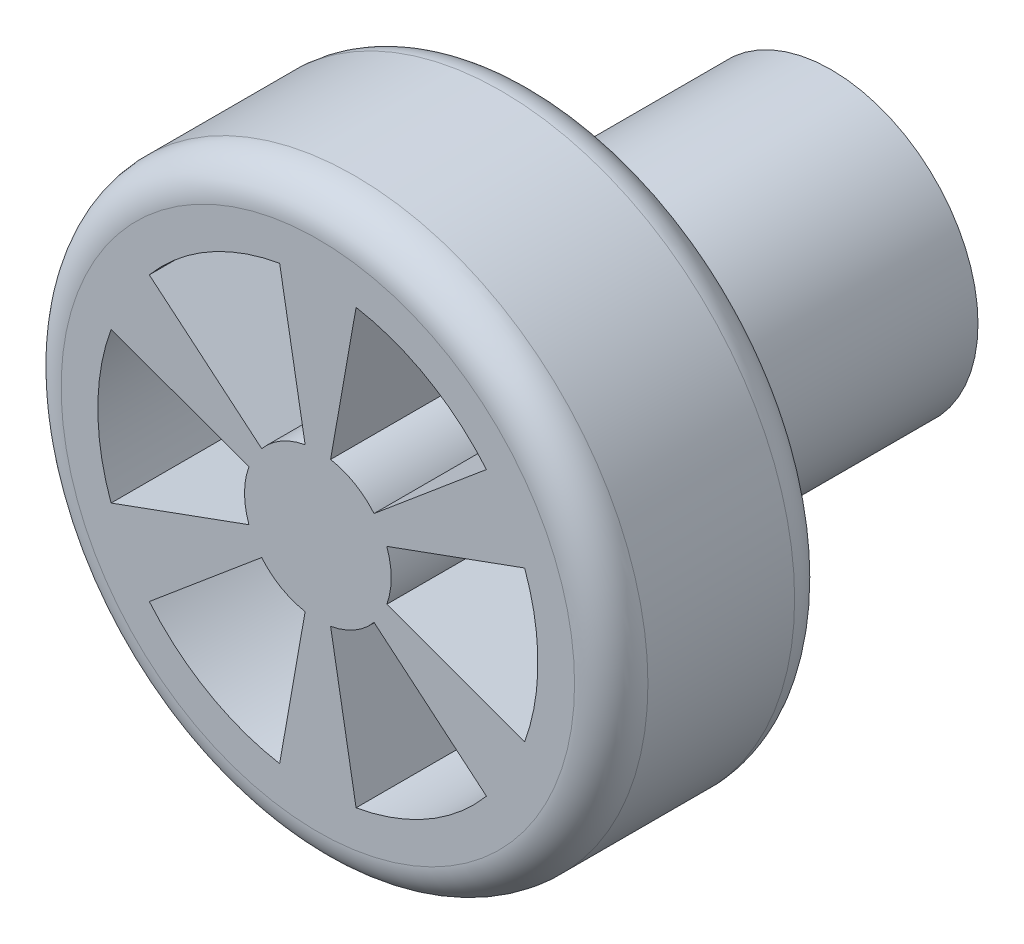
ISO-10303-21;
HEADER;
FILE_DESCRIPTION(('STEP AP214'),'2;1');
FILE_NAME('part.step','',(''),(''),'','','');
FILE_SCHEMA(('AUTOMOTIVE_DESIGN { 1 0 10303 214 1 1 1 1 }'));
ENDSEC;
DATA;
#1=APPLICATION_CONTEXT('core data for automotive mechanical design processes');
#2=APPLICATION_PROTOCOL_DEFINITION('international standard','automotive_design',2000,#1);
#3=PRODUCT_CONTEXT('',#1,'mechanical');
#4=PRODUCT('Part','Part','',(#3));
#5=PRODUCT_RELATED_PRODUCT_CATEGORY('part','',(#4));
#6=PRODUCT_DEFINITION_FORMATION('','',#4);
#7=PRODUCT_DEFINITION_CONTEXT('part definition',#1,'design');
#8=PRODUCT_DEFINITION('design','',#6,#7);
#9=PRODUCT_DEFINITION_SHAPE('','',#8);
#10=(LENGTH_UNIT() NAMED_UNIT(*) SI_UNIT(.MILLI.,.METRE.));
#11=(NAMED_UNIT(*) PLANE_ANGLE_UNIT() SI_UNIT($,.RADIAN.));
#12=(NAMED_UNIT(*) SI_UNIT($,.STERADIAN.) SOLID_ANGLE_UNIT());
#13=UNCERTAINTY_MEASURE_WITH_UNIT(LENGTH_MEASURE(1.E-05),#10,'distance_accuracy_value','');
#14=(GEOMETRIC_REPRESENTATION_CONTEXT(3) GLOBAL_UNCERTAINTY_ASSIGNED_CONTEXT((#13)) GLOBAL_UNIT_ASSIGNED_CONTEXT((#10,
#11,#12)) REPRESENTATION_CONTEXT('',''));
#15=CARTESIAN_POINT('',(0.,0.,0.));
#16=DIRECTION('',(0.,0.,1.));
#17=DIRECTION('',(1.,0.,0.));
#18=AXIS2_PLACEMENT_3D('',#15,#16,#17);
#19=CARTESIAN_POINT('',(0.,0.,-101.6));
#20=DIRECTION('',(0.,0.,1.));
#21=DIRECTION('',(1.,0.,0.));
#22=AXIS2_PLACEMENT_3D('',#19,#20,#21);
#23=CYLINDRICAL_SURFACE('',#22,50.8);
#24=CARTESIAN_POINT('',(0.,0.,-101.6));
#25=DIRECTION('',(0.,0.,-1.));
#26=DIRECTION('',(-1.,0.,0.));
#27=AXIS2_PLACEMENT_3D('',#24,#25,#26);
#28=CIRCLE('',#27,50.8);
#29=CARTESIAN_POINT('',(-50.8,0.,-101.6));
#30=VERTEX_POINT('',#29);
#31=EDGE_CURVE('E11',#30,#30,#28,.T.);
#32=ORIENTED_EDGE('',*,*,#31,.F.);
#33=EDGE_LOOP('',(#32));
#34=FACE_BOUND('',#33,.T.);
#35=CARTESIAN_POINT('',(0.,0.,0.));
#36=DIRECTION('',(0.,0.,-1.));
#37=DIRECTION('',(-1.,0.,0.));
#38=AXIS2_PLACEMENT_3D('',#35,#36,#37);
#39=CIRCLE('',#38,50.8);
#40=CARTESIAN_POINT('',(-50.8,0.,0.));
#41=VERTEX_POINT('',#40);
#42=EDGE_CURVE('E50',#41,#41,#39,.T.);
#43=ORIENTED_EDGE('',*,*,#42,.T.);
#44=EDGE_LOOP('',(#43));
#45=FACE_BOUND('',#44,.T.);
#46=ADVANCED_FACE('F47',(#34,#45),#23,.T.);
#47=CARTESIAN_POINT('',(0.,0.,-101.6));
#48=DIRECTION('',(0.,0.,-1.));
#49=DIRECTION('',(-1.,0.,0.));
#50=AXIS2_PLACEMENT_3D('',#47,#48,#49);
#51=PLANE('',#50);
#52=ORIENTED_EDGE('',*,*,#31,.T.);
#53=EDGE_LOOP('',(#52));
#54=FACE_BOUND('',#53,.T.);
#55=ADVANCED_FACE('F62',(#54),#51,.T.);
#56=CARTESIAN_POINT('',(0.,0.,0.));
#57=DIRECTION('',(0.,0.,-1.));
#58=DIRECTION('',(-1.,0.,0.));
#59=AXIS2_PLACEMENT_3D('',#56,#57,#58);
#60=PLANE('',#59);
#61=ORIENTED_EDGE('',*,*,#42,.F.);
#62=EDGE_LOOP('',(#61));
#63=FACE_BOUND('',#62,.T.);
#64=ADVANCED_FACE('F60',(#63),#60,.F.);
#65=CLOSED_SHELL('',(#46,#55,#64));
#66=MANIFOLD_SOLID_BREP('B2',#65);
#67=CARTESIAN_POINT('',(0.,0.,76.2));
#68=DIRECTION('',(0.,0.,-1.));
#69=DIRECTION('',(-1.,0.,0.));
#70=AXIS2_PLACEMENT_3D('',#67,#68,#69);
#71=CYLINDRICAL_SURFACE('',#70,101.6);
#72=CARTESIAN_POINT('',(0.,0.,12.7));
#73=DIRECTION('',(0.,0.,1.));
#74=DIRECTION('',(1.,0.,0.));
#75=AXIS2_PLACEMENT_3D('',#72,#73,#74);
#76=CIRCLE('',#75,101.6);
#77=CARTESIAN_POINT('',(-101.6,0.,12.7));
#78=VERTEX_POINT('',#77);
#79=EDGE_CURVE('E523',#78,#78,#76,.T.);
#80=CARTESIAN_POINT('',(0.,0.,63.5));
#81=DIRECTION('',(0.,0.,1.));
#82=DIRECTION('',(1.,0.,0.));
#83=AXIS2_PLACEMENT_3D('',#80,#81,#82);
#84=CIRCLE('',#83,101.6);
#85=CARTESIAN_POINT('',(-101.6,0.,63.5));
#86=VERTEX_POINT('',#85);
#87=EDGE_CURVE('E519',#86,#86,#84,.F.);
#88=CARTESIAN_POINT('',(-101.6,0.,12.7));
#89=CARTESIAN_POINT('',(-101.6,0.,13.2291666666667));
#90=CARTESIAN_POINT('',(-101.6,0.,13.7583333333333));
#91=CARTESIAN_POINT('',(-101.6,0.,14.8166666666666));
#92=CARTESIAN_POINT('',(-101.6,0.,15.3458333333333));
#93=CARTESIAN_POINT('',(-101.6,0.,16.4041666666666));
#94=CARTESIAN_POINT('',(-101.6,0.,16.9333333333333));
#95=CARTESIAN_POINT('',(-101.6,0.,17.9916666666667));
#96=CARTESIAN_POINT('',(-101.6,0.,18.5208333333333));
#97=CARTESIAN_POINT('',(-101.6,0.,19.5791666666667));
#98=CARTESIAN_POINT('',(-101.6,0.,20.1083333333333));
#99=CARTESIAN_POINT('',(-101.6,0.,21.1666666666667));
#100=CARTESIAN_POINT('',(-101.6,0.,21.6958333333333));
#101=CARTESIAN_POINT('',(-101.6,0.,22.7541666666667));
#102=CARTESIAN_POINT('',(-101.6,0.,23.2833333333333));
#103=CARTESIAN_POINT('',(-101.6,0.,24.3416666666667));
#104=CARTESIAN_POINT('',(-101.6,0.,24.8708333333333));
#105=CARTESIAN_POINT('',(-101.6,0.,25.9291666666667));
#106=CARTESIAN_POINT('',(-101.6,0.,26.4583333333333));
#107=CARTESIAN_POINT('',(-101.6,0.,27.5166666666667));
#108=CARTESIAN_POINT('',(-101.6,0.,28.0458333333333));
#109=CARTESIAN_POINT('',(-101.6,0.,29.1041666666667));
#110=CARTESIAN_POINT('',(-101.6,0.,29.6333333333333));
#111=CARTESIAN_POINT('',(-101.6,0.,30.6916666666667));
#112=CARTESIAN_POINT('',(-101.6,0.,31.2208333333333));
#113=CARTESIAN_POINT('',(-101.6,0.,32.2791666666666));
#114=CARTESIAN_POINT('',(-101.6,0.,32.8083333333333));
#115=CARTESIAN_POINT('',(-101.6,0.,33.8666666666667));
#116=CARTESIAN_POINT('',(-101.6,0.,34.3958333333333));
#117=CARTESIAN_POINT('',(-101.6,0.,35.4541666666667));
#118=CARTESIAN_POINT('',(-101.6,0.,35.9833333333333));
#119=CARTESIAN_POINT('',(-101.6,0.,37.0416666666667));
#120=CARTESIAN_POINT('',(-101.6,0.,37.5708333333333));
#121=CARTESIAN_POINT('',(-101.6,0.,38.6291666666666));
#122=CARTESIAN_POINT('',(-101.6,0.,39.1583333333333));
#123=CARTESIAN_POINT('',(-101.6,0.,40.2166666666666));
#124=CARTESIAN_POINT('',(-101.6,0.,40.7458333333333));
#125=CARTESIAN_POINT('',(-101.6,0.,41.8041666666667));
#126=CARTESIAN_POINT('',(-101.6,0.,42.3333333333333));
#127=CARTESIAN_POINT('',(-101.6,0.,43.3916666666667));
#128=CARTESIAN_POINT('',(-101.6,0.,43.9208333333333));
#129=CARTESIAN_POINT('',(-101.6,0.,44.9791666666667));
#130=CARTESIAN_POINT('',(-101.6,0.,45.5083333333333));
#131=CARTESIAN_POINT('',(-101.6,0.,46.5666666666666));
#132=CARTESIAN_POINT('',(-101.6,0.,47.0958333333333));
#133=CARTESIAN_POINT('',(-101.6,0.,48.1541666666667));
#134=CARTESIAN_POINT('',(-101.6,0.,48.6833333333333));
#135=CARTESIAN_POINT('',(-101.6,0.,49.7416666666667));
#136=CARTESIAN_POINT('',(-101.6,0.,50.2708333333333));
#137=CARTESIAN_POINT('',(-101.6,0.,51.3291666666667));
#138=CARTESIAN_POINT('',(-101.6,0.,51.8583333333333));
#139=CARTESIAN_POINT('',(-101.6,0.,52.9166666666667));
#140=CARTESIAN_POINT('',(-101.6,0.,53.4458333333333));
#141=CARTESIAN_POINT('',(-101.6,0.,54.5041666666666));
#142=CARTESIAN_POINT('',(-101.6,0.,55.0333333333333));
#143=CARTESIAN_POINT('',(-101.6,0.,56.0916666666667));
#144=CARTESIAN_POINT('',(-101.6,0.,56.6208333333333));
#145=CARTESIAN_POINT('',(-101.6,0.,57.6791666666667));
#146=CARTESIAN_POINT('',(-101.6,0.,58.2083333333333));
#147=CARTESIAN_POINT('',(-101.6,0.,59.2666666666667));
#148=CARTESIAN_POINT('',(-101.6,0.,59.7958333333333));
#149=CARTESIAN_POINT('',(-101.6,0.,60.8541666666667));
#150=CARTESIAN_POINT('',(-101.6,0.,61.3833333333333));
#151=CARTESIAN_POINT('',(-101.6,0.,62.4416666666667));
#152=CARTESIAN_POINT('',(-101.6,0.,62.9708333333333));
#153=CARTESIAN_POINT('',(-101.6,0.,63.5));
#154=B_SPLINE_CURVE_WITH_KNOTS('',3,(#88,#89,#90,#91,#92,#93,#94,#95,#96,#97,#98,#99,#100,#101,
#102,#103,#104,#105,#106,#107,#108,#109,#110,#111,#112,#113,#114,#115,#116,#117,#118,#119,#120,
#121,#122,#123,#124,#125,#126,#127,#128,#129,#130,#131,#132,#133,#134,#135,#136,#137,#138,#139,
#140,#141,#142,#143,#144,#145,#146,#147,#148,#149,#150,#151,#152,#153),.UNSPECIFIED.,.F.,.F.,(4,
2,2,2,2,2,2,2,2,2,2,2,2,2,2,2,2,2,2,2,2,2,2,2,2,2,2,2,2,2,2,2,4),(0.,1.58749999999999,
3.17499999999999,4.7625,6.34999999999999,7.93749999999999,9.525,11.1125,12.7,14.2875,15.875,
17.4625,19.05,20.6375,22.225,23.8125,25.4,26.9875,28.575,30.1625,31.75,33.3375,34.925,36.5125,
38.1,39.6875,41.275,42.8625,44.45,46.0375,47.625,49.2125,50.8),.UNSPECIFIED.);
#155=EDGE_CURVE('BSEAM88',#78,#86,#154,.T.);
#156=ORIENTED_EDGE('',*,*,#79,.T.);
#157=ORIENTED_EDGE('',*,*,#87,.T.);
#158=ORIENTED_EDGE('',*,*,#155,.T.);
#159=ORIENTED_EDGE('',*,*,#155,.F.);
#160=EDGE_LOOP('',(#156,#158,#157,#159));
#161=FACE_BOUND('',#160,.T.);
#162=ADVANCED_FACE('F88',(#161),#71,.T.);
#163=CARTESIAN_POINT('',(0.,0.,76.2));
#164=DIRECTION('',(0.,0.,1.));
#165=DIRECTION('',(1.,0.,0.));
#166=AXIS2_PLACEMENT_3D('',#163,#164,#165);
#167=PLANE('',#166);
#168=CARTESIAN_POINT('',(0.,0.,76.2));
#169=DIRECTION('',(0.,0.,1.));
#170=DIRECTION('',(1.,0.,0.));
#171=AXIS2_PLACEMENT_3D('',#168,#169,#170);
#172=CIRCLE('',#171,88.9);
#173=CARTESIAN_POINT('',(88.9,0.,76.2));
#174=VERTEX_POINT('',#173);
#175=EDGE_CURVE('E45',#174,#174,#172,.T.);
#176=ORIENTED_EDGE('',*,*,#175,.T.);
#177=EDGE_LOOP('',(#176));
#178=FACE_BOUND('',#177,.T.);
#179=CARTESIAN_POINT('',(0.,0.,76.2));
#180=DIRECTION('',(0.,0.,1.));
#181=DIRECTION('',(1.,0.,0.));
#182=AXIS2_PLACEMENT_3D('',#179,#180,#181);
#183=CIRCLE('',#182,25.4);
#184=CARTESIAN_POINT('',(23.8681925679621,-8.68731164047183,76.2));
#185=VERTEX_POINT('',#184);
#186=CARTESIAN_POINT('',(23.868192567962,8.68731164047217,76.2));
#187=VERTEX_POINT('',#186);
#188=EDGE_CURVE('E353',#185,#187,#183,.T.);
#189=ORIENTED_EDGE('',*,*,#188,.T.);
#190=DIRECTION('',(0.939692620785906,0.342020143325676,0.));
#191=VECTOR('',#190,1.);
#192=CARTESIAN_POINT('',(23.868192567962,8.68731164047217,76.2));
#193=LINE('',#192,#191);
#194=CARTESIAN_POINT('',(71.604577703886,26.0619349214165,76.2));
#195=VERTEX_POINT('',#194);
#196=EDGE_CURVE('E375',#187,#195,#193,.T.);
#197=ORIENTED_EDGE('',*,*,#196,.T.);
#198=CARTESIAN_POINT('',(0.,0.,76.2));
#199=DIRECTION('',(0.,0.,1.));
#200=DIRECTION('',(1.,0.,0.));
#201=AXIS2_PLACEMENT_3D('',#198,#199,#200);
#202=CIRCLE('',#201,76.2);
#203=CARTESIAN_POINT('',(71.6045777038864,-26.0619349214155,76.2));
#204=VERTEX_POINT('',#203);
#205=EDGE_CURVE('E345',#195,#204,#202,.F.);
#206=ORIENTED_EDGE('',*,*,#205,.T.);
#207=DIRECTION('',(-0.939692620785911,0.342020143325663,0.));
#208=VECTOR('',#207,1.);
#209=CARTESIAN_POINT('',(23.8681925679621,-8.68731164047183,76.2));
#210=LINE('',#209,#208);
#211=EDGE_CURVE('E349',#204,#185,#210,.T.);
#212=ORIENTED_EDGE('',*,*,#211,.T.);
#213=EDGE_LOOP('',(#189,#197,#206,#212));
#214=FACE_BOUND('',#213,.T.);
#215=CARTESIAN_POINT('',(0.,0.,76.2));
#216=DIRECTION('',(0.,0.,1.));
#217=DIRECTION('',(1.,0.,0.));
#218=AXIS2_PLACEMENT_3D('',#215,#216,#217);
#219=CIRCLE('',#218,25.4);
#220=CARTESIAN_POINT('',(19.4575288552219,16.3268052860383,76.2));
#221=VERTEX_POINT('',#220);
#222=CARTESIAN_POINT('',(4.41066371273978,25.0141169265101,76.2));
#223=VERTEX_POINT('',#222);
#224=EDGE_CURVE('E311',#221,#223,#219,.T.);
#225=ORIENTED_EDGE('',*,*,#224,.T.);
#226=DIRECTION('',(0.17364817766692,0.98480775301221,0.));
#227=VECTOR('',#226,1.);
#228=CARTESIAN_POINT('',(4.41066371273978,25.0141169265101,76.2));
#229=LINE('',#228,#227);
#230=CARTESIAN_POINT('',(13.2319911382193,75.0423507795304,76.2));
#231=VERTEX_POINT('',#230);
#232=EDGE_CURVE('E333',#223,#231,#229,.T.);
#233=ORIENTED_EDGE('',*,*,#232,.T.);
#234=CARTESIAN_POINT('',(0.,0.,76.2));
#235=DIRECTION('',(0.,0.,1.));
#236=DIRECTION('',(1.,0.,0.));
#237=AXIS2_PLACEMENT_3D('',#234,#235,#236);
#238=CIRCLE('',#237,76.2);
#239=CARTESIAN_POINT('',(58.3725865656657,48.9804158581148,76.2));
#240=VERTEX_POINT('',#239);
#241=EDGE_CURVE('E262',#231,#240,#238,.F.);
#242=ORIENTED_EDGE('',*,*,#241,.T.);
#243=DIRECTION('',(-0.766044443118973,-0.642787609686546,0.));
#244=VECTOR('',#243,1.);
#245=CARTESIAN_POINT('',(19.4575288552219,16.3268052860383,76.2));
#246=LINE('',#245,#244);
#247=EDGE_CURVE('E307',#240,#221,#246,.T.);
#248=ORIENTED_EDGE('',*,*,#247,.T.);
#249=EDGE_LOOP('',(#225,#233,#242,#248));
#250=FACE_BOUND('',#249,.T.);
#251=CARTESIAN_POINT('',(0.,0.,76.2));
#252=DIRECTION('',(0.,0.,1.));
#253=DIRECTION('',(1.,0.,0.));
#254=AXIS2_PLACEMENT_3D('',#251,#252,#253);
#255=CIRCLE('',#254,25.4);
#256=CARTESIAN_POINT('',(4.41066371274013,-25.0141169265101,76.2));
#257=VERTEX_POINT('',#256);
#258=CARTESIAN_POINT('',(19.4575288552221,-16.326805286038,76.2));
#259=VERTEX_POINT('',#258);
#260=EDGE_CURVE('E441',#257,#259,#255,.T.);
#261=ORIENTED_EDGE('',*,*,#260,.T.);
#262=DIRECTION('',(0.766044443118982,-0.642787609686535,0.));
#263=VECTOR('',#262,1.);
#264=CARTESIAN_POINT('',(19.4575288552221,-16.326805286038,76.2));
#265=LINE('',#264,#263);
#266=CARTESIAN_POINT('',(58.3725865656664,-48.980415858114,76.2));
#267=VERTEX_POINT('',#266);
#268=EDGE_CURVE('E393',#259,#267,#265,.T.);
#269=ORIENTED_EDGE('',*,*,#268,.T.);
#270=CARTESIAN_POINT('',(0.,0.,76.2));
#271=DIRECTION('',(0.,0.,1.));
#272=DIRECTION('',(1.,0.,0.));
#273=AXIS2_PLACEMENT_3D('',#270,#271,#272);
#274=CIRCLE('',#273,76.2);
#275=CARTESIAN_POINT('',(13.2319911382204,-75.0423507795302,76.2));
#276=VERTEX_POINT('',#275);
#277=EDGE_CURVE('E387',#267,#276,#274,.F.);
#278=ORIENTED_EDGE('',*,*,#277,.T.);
#279=DIRECTION('',(-0.173648177666934,0.984807753012208,0.));
#280=VECTOR('',#279,1.);
#281=CARTESIAN_POINT('',(4.41066371274013,-25.0141169265101,76.2));
#282=LINE('',#281,#280);
#283=EDGE_CURVE('E437',#276,#257,#282,.T.);
#284=ORIENTED_EDGE('',*,*,#283,.T.);
#285=EDGE_LOOP('',(#261,#269,#278,#284));
#286=FACE_BOUND('',#285,.T.);
#287=CARTESIAN_POINT('',(0.,0.,76.2));
#288=DIRECTION('',(0.,0.,1.));
#289=DIRECTION('',(1.,0.,0.));
#290=AXIS2_PLACEMENT_3D('',#287,#288,#289);
#291=CIRCLE('',#290,25.4);
#292=CARTESIAN_POINT('',(-19.457528855222,-16.3268052860381,76.2));
#293=VERTEX_POINT('',#292);
#294=CARTESIAN_POINT('',(-4.41066371273996,-25.0141169265101,76.2));
#295=VERTEX_POINT('',#294);
#296=EDGE_CURVE('E397',#293,#295,#291,.T.);
#297=ORIENTED_EDGE('',*,*,#296,.T.);
#298=DIRECTION('',(-0.173648177666927,-0.984807753012209,0.));
#299=VECTOR('',#298,1.);
#300=CARTESIAN_POINT('',(-4.41066371273996,-25.0141169265101,76.2));
#301=LINE('',#300,#299);
#302=CARTESIAN_POINT('',(-13.2319911382199,-75.0423507795303,76.2));
#303=VERTEX_POINT('',#302);
#304=EDGE_CURVE('E420',#295,#303,#301,.T.);
#305=ORIENTED_EDGE('',*,*,#304,.T.);
#306=CARTESIAN_POINT('',(0.,0.,76.2));
#307=DIRECTION('',(0.,0.,1.));
#308=DIRECTION('',(1.,0.,0.));
#309=AXIS2_PLACEMENT_3D('',#306,#307,#308);
#310=CIRCLE('',#309,76.2);
#311=CARTESIAN_POINT('',(-58.3725865656661,-48.9804158581144,76.2));
#312=VERTEX_POINT('',#311);
#313=EDGE_CURVE('E388',#303,#312,#310,.F.);
#314=ORIENTED_EDGE('',*,*,#313,.T.);
#315=DIRECTION('',(0.766044443118977,0.642787609686541,0.));
#316=VECTOR('',#315,1.);
#317=CARTESIAN_POINT('',(-19.457528855222,-16.3268052860381,76.2));
#318=LINE('',#317,#316);
#319=EDGE_CURVE('E392',#312,#293,#318,.T.);
#320=ORIENTED_EDGE('',*,*,#319,.T.);
#321=EDGE_LOOP('',(#297,#305,#314,#320));
#322=FACE_BOUND('',#321,.T.);
#323=CARTESIAN_POINT('',(0.,0.,76.2));
#324=DIRECTION('',(0.,0.,1.));
#325=DIRECTION('',(1.,0.,0.));
#326=AXIS2_PLACEMENT_3D('',#323,#324,#325);
#327=CIRCLE('',#326,25.4);
#328=CARTESIAN_POINT('',(-4.41066371274031,25.01411692651,76.2));
#329=VERTEX_POINT('',#328);
#330=CARTESIAN_POINT('',(-19.4575288552222,16.3268052860379,76.2));
#331=VERTEX_POINT('',#330);
#332=EDGE_CURVE('E267',#329,#331,#327,.T.);
#333=ORIENTED_EDGE('',*,*,#332,.T.);
#334=DIRECTION('',(-0.766044443118986,0.64278760968653,0.));
#335=VECTOR('',#334,1.);
#336=CARTESIAN_POINT('',(-19.4575288552222,16.3268052860379,76.2));
#337=LINE('',#336,#335);
#338=CARTESIAN_POINT('',(-58.3725865656668,48.9804158581136,76.2));
#339=VERTEX_POINT('',#338);
#340=EDGE_CURVE('E250',#331,#339,#337,.T.);
#341=ORIENTED_EDGE('',*,*,#340,.T.);
#342=CARTESIAN_POINT('',(0.,0.,76.2));
#343=DIRECTION('',(0.,0.,1.));
#344=DIRECTION('',(1.,0.,0.));
#345=AXIS2_PLACEMENT_3D('',#342,#343,#344);
#346=CIRCLE('',#345,76.2);
#347=CARTESIAN_POINT('',(-13.2319911382209,75.0423507795301,76.2));
#348=VERTEX_POINT('',#347);
#349=EDGE_CURVE('E284',#339,#348,#346,.F.);
#350=ORIENTED_EDGE('',*,*,#349,.T.);
#351=DIRECTION('',(0.173648177666941,-0.984807753012206,0.));
#352=VECTOR('',#351,1.);
#353=CARTESIAN_POINT('',(-4.41066371274031,25.01411692651,76.2));
#354=LINE('',#353,#352);
#355=EDGE_CURVE('E277',#348,#329,#354,.T.);
#356=ORIENTED_EDGE('',*,*,#355,.T.);
#357=EDGE_LOOP('',(#333,#341,#350,#356));
#358=FACE_BOUND('',#357,.T.);
#359=CARTESIAN_POINT('',(0.,0.,76.2));
#360=DIRECTION('',(0.,0.,1.));
#361=DIRECTION('',(1.,0.,0.));
#362=AXIS2_PLACEMENT_3D('',#359,#360,#361);
#363=CIRCLE('',#362,25.4);
#364=CARTESIAN_POINT('',(-23.8681925679621,8.687311640472,76.2));
#365=VERTEX_POINT('',#364);
#366=CARTESIAN_POINT('',(-23.8681925679621,-8.687311640472,76.2));
#367=VERTEX_POINT('',#366);
#368=EDGE_CURVE('E483',#365,#367,#363,.T.);
#369=ORIENTED_EDGE('',*,*,#368,.T.);
#370=DIRECTION('',(-0.939692620785908,-0.342020143325669,0.));
#371=VECTOR('',#370,1.);
#372=CARTESIAN_POINT('',(-23.8681925679621,-8.687311640472,76.2));
#373=LINE('',#372,#371);
#374=CARTESIAN_POINT('',(-71.6045777038862,-26.061934921416,76.2));
#375=VERTEX_POINT('',#374);
#376=EDGE_CURVE('E506',#367,#375,#373,.T.);
#377=ORIENTED_EDGE('',*,*,#376,.T.);
#378=CARTESIAN_POINT('',(0.,0.,76.2));
#379=DIRECTION('',(0.,0.,1.));
#380=DIRECTION('',(1.,0.,0.));
#381=AXIS2_PLACEMENT_3D('',#378,#379,#380);
#382=CIRCLE('',#381,76.2);
#383=CARTESIAN_POINT('',(-71.6045777038862,26.061934921416,76.2));
#384=VERTEX_POINT('',#383);
#385=EDGE_CURVE('E433',#375,#384,#382,.F.);
#386=ORIENTED_EDGE('',*,*,#385,.T.);
#387=DIRECTION('',(0.939692620785908,-0.342020143325669,0.));
#388=VECTOR('',#387,1.);
#389=CARTESIAN_POINT('',(-23.8681925679621,8.687311640472,76.2));
#390=LINE('',#389,#388);
#391=EDGE_CURVE('E479',#384,#365,#390,.T.);
#392=ORIENTED_EDGE('',*,*,#391,.T.);
#393=EDGE_LOOP('',(#369,#377,#386,#392));
#394=FACE_BOUND('',#393,.T.);
#395=ADVANCED_FACE('F275',(#178,#214,#250,#286,#322,#358,#394),#167,.T.);
#396=CARTESIAN_POINT('',(0.,0.,0.));
#397=DIRECTION('',(0.,0.,1.));
#398=DIRECTION('',(1.,0.,0.));
#399=AXIS2_PLACEMENT_3D('',#396,#397,#398);
#400=PLANE('',#399);
#401=CARTESIAN_POINT('',(0.,0.,0.));
#402=DIRECTION('',(0.,0.,1.));
#403=DIRECTION('',(1.,0.,0.));
#404=AXIS2_PLACEMENT_3D('',#401,#402,#403);
#405=CIRCLE('',#404,88.9);
#406=CARTESIAN_POINT('',(88.9,0.,0.));
#407=VERTEX_POINT('',#406);
#408=EDGE_CURVE('E97',#407,#407,#405,.F.);
#409=ORIENTED_EDGE('',*,*,#408,.T.);
#410=EDGE_LOOP('',(#409));
#411=FACE_BOUND('',#410,.T.);
#412=DIRECTION('',(0.939692620785906,0.342020143325676,0.));
#413=VECTOR('',#412,1.);
#414=CARTESIAN_POINT('',(23.868192567962,8.68731164047217,0.));
#415=LINE('',#414,#413);
#416=CARTESIAN_POINT('',(23.868192567962,8.68731164047217,0.));
#417=VERTEX_POINT('',#416);
#418=CARTESIAN_POINT('',(71.604577703886,26.0619349214165,0.));
#419=VERTEX_POINT('',#418);
#420=EDGE_CURVE('E360',#417,#419,#415,.T.);
#421=ORIENTED_EDGE('',*,*,#420,.F.);
#422=CARTESIAN_POINT('',(0.,0.,0.));
#423=DIRECTION('',(0.,0.,1.));
#424=DIRECTION('',(-1.,0.,0.));
#425=AXIS2_PLACEMENT_3D('',#422,#423,#424);
#426=CIRCLE('',#425,25.4);
#427=CARTESIAN_POINT('',(23.8681925679621,-8.68731164047183,0.));
#428=VERTEX_POINT('',#427);
#429=EDGE_CURVE('E357',#428,#417,#426,.T.);
#430=ORIENTED_EDGE('',*,*,#429,.F.);
#431=DIRECTION('',(-0.939692620785911,0.342020143325663,0.));
#432=VECTOR('',#431,1.);
#433=CARTESIAN_POINT('',(23.8681925679621,-8.68731164047183,0.));
#434=LINE('',#433,#432);
#435=CARTESIAN_POINT('',(71.6045777038864,-26.0619349214155,0.));
#436=VERTEX_POINT('',#435);
#437=EDGE_CURVE('E367',#436,#428,#434,.T.);
#438=ORIENTED_EDGE('',*,*,#437,.F.);
#439=CARTESIAN_POINT('',(0.,0.,0.));
#440=DIRECTION('',(0.,0.,-1.));
#441=DIRECTION('',(-1.,0.,0.));
#442=AXIS2_PLACEMENT_3D('',#439,#440,#441);
#443=CIRCLE('',#442,76.2);
#444=EDGE_CURVE('E363',#419,#436,#443,.T.);
#445=ORIENTED_EDGE('',*,*,#444,.F.);
#446=EDGE_LOOP('',(#421,#430,#438,#445));
#447=FACE_BOUND('',#446,.T.);
#448=DIRECTION('',(0.17364817766692,0.98480775301221,0.));
#449=VECTOR('',#448,1.);
#450=CARTESIAN_POINT('',(4.41066371273978,25.0141169265101,0.));
#451=LINE('',#450,#449);
#452=CARTESIAN_POINT('',(4.41066371273978,25.0141169265101,0.));
#453=VERTEX_POINT('',#452);
#454=CARTESIAN_POINT('',(13.2319911382193,75.0423507795304,0.));
#455=VERTEX_POINT('',#454);
#456=EDGE_CURVE('E318',#453,#455,#451,.T.);
#457=ORIENTED_EDGE('',*,*,#456,.F.);
#458=CARTESIAN_POINT('',(0.,0.,0.));
#459=DIRECTION('',(0.,0.,1.));
#460=DIRECTION('',(-1.,0.,0.));
#461=AXIS2_PLACEMENT_3D('',#458,#459,#460);
#462=CIRCLE('',#461,25.4);
#463=CARTESIAN_POINT('',(19.4575288552219,16.3268052860383,0.));
#464=VERTEX_POINT('',#463);
#465=EDGE_CURVE('E315',#464,#453,#462,.T.);
#466=ORIENTED_EDGE('',*,*,#465,.F.);
#467=DIRECTION('',(-0.766044443118973,-0.642787609686546,0.));
#468=VECTOR('',#467,1.);
#469=CARTESIAN_POINT('',(19.4575288552219,16.3268052860383,0.));
#470=LINE('',#469,#468);
#471=CARTESIAN_POINT('',(58.3725865656657,48.9804158581148,0.));
#472=VERTEX_POINT('',#471);
#473=EDGE_CURVE('E325',#472,#464,#470,.T.);
#474=ORIENTED_EDGE('',*,*,#473,.F.);
#475=CARTESIAN_POINT('',(0.,0.,0.));
#476=DIRECTION('',(0.,0.,-1.));
#477=DIRECTION('',(-1.,0.,0.));
#478=AXIS2_PLACEMENT_3D('',#475,#476,#477);
#479=CIRCLE('',#478,76.2);
#480=EDGE_CURVE('E321',#455,#472,#479,.T.);
#481=ORIENTED_EDGE('',*,*,#480,.F.);
#482=EDGE_LOOP('',(#457,#466,#474,#481));
#483=FACE_BOUND('',#482,.T.);
#484=DIRECTION('',(0.766044443118982,-0.642787609686535,0.));
#485=VECTOR('',#484,1.);
#486=CARTESIAN_POINT('',(19.4575288552221,-16.326805286038,0.));
#487=LINE('',#486,#485);
#488=CARTESIAN_POINT('',(19.4575288552221,-16.326805286038,0.));
#489=VERTEX_POINT('',#488);
#490=CARTESIAN_POINT('',(58.3725865656664,-48.980415858114,0.));
#491=VERTEX_POINT('',#490);
#492=EDGE_CURVE('E448',#489,#491,#487,.T.);
#493=ORIENTED_EDGE('',*,*,#492,.F.);
#494=CARTESIAN_POINT('',(0.,0.,0.));
#495=DIRECTION('',(0.,0.,1.));
#496=DIRECTION('',(-1.,0.,0.));
#497=AXIS2_PLACEMENT_3D('',#494,#495,#496);
#498=CIRCLE('',#497,25.4);
#499=CARTESIAN_POINT('',(4.41066371274013,-25.0141169265101,0.));
#500=VERTEX_POINT('',#499);
#501=EDGE_CURVE('E445',#500,#489,#498,.T.);
#502=ORIENTED_EDGE('',*,*,#501,.F.);
#503=DIRECTION('',(-0.173648177666934,0.984807753012207,0.));
#504=VECTOR('',#503,1.);
#505=CARTESIAN_POINT('',(4.41066371274013,-25.0141169265101,0.));
#506=LINE('',#505,#504);
#507=CARTESIAN_POINT('',(13.2319911382204,-75.0423507795302,0.));
#508=VERTEX_POINT('',#507);
#509=EDGE_CURVE('E456',#508,#500,#506,.T.);
#510=ORIENTED_EDGE('',*,*,#509,.F.);
#511=CARTESIAN_POINT('',(0.,0.,0.));
#512=DIRECTION('',(0.,0.,-1.));
#513=DIRECTION('',(-1.,0.,0.));
#514=AXIS2_PLACEMENT_3D('',#511,#512,#513);
#515=CIRCLE('',#514,76.2);
#516=EDGE_CURVE('E452',#491,#508,#515,.T.);
#517=ORIENTED_EDGE('',*,*,#516,.F.);
#518=EDGE_LOOP('',(#493,#502,#510,#517));
#519=FACE_BOUND('',#518,.T.);
#520=DIRECTION('',(-0.173648177666927,-0.984807753012209,0.));
#521=VECTOR('',#520,1.);
#522=CARTESIAN_POINT('',(-4.41066371273996,-25.0141169265101,0.));
#523=LINE('',#522,#521);
#524=CARTESIAN_POINT('',(-4.41066371273995,-25.0141169265101,0.));
#525=VERTEX_POINT('',#524);
#526=CARTESIAN_POINT('',(-13.2319911382199,-75.0423507795303,0.));
#527=VERTEX_POINT('',#526);
#528=EDGE_CURVE('E404',#525,#527,#523,.T.);
#529=ORIENTED_EDGE('',*,*,#528,.F.);
#530=CARTESIAN_POINT('',(0.,0.,0.));
#531=DIRECTION('',(0.,0.,1.));
#532=DIRECTION('',(-1.,0.,0.));
#533=AXIS2_PLACEMENT_3D('',#530,#531,#532);
#534=CIRCLE('',#533,25.4);
#535=CARTESIAN_POINT('',(-19.457528855222,-16.3268052860381,0.));
#536=VERTEX_POINT('',#535);
#537=EDGE_CURVE('E401',#536,#525,#534,.T.);
#538=ORIENTED_EDGE('',*,*,#537,.F.);
#539=DIRECTION('',(0.766044443118977,0.642787609686541,0.));
#540=VECTOR('',#539,1.);
#541=CARTESIAN_POINT('',(-19.457528855222,-16.3268052860381,0.));
#542=LINE('',#541,#540);
#543=CARTESIAN_POINT('',(-58.3725865656661,-48.9804158581144,0.));
#544=VERTEX_POINT('',#543);
#545=EDGE_CURVE('E412',#544,#536,#542,.T.);
#546=ORIENTED_EDGE('',*,*,#545,.F.);
#547=CARTESIAN_POINT('',(0.,0.,0.));
#548=DIRECTION('',(0.,0.,-1.));
#549=DIRECTION('',(-1.,0.,0.));
#550=AXIS2_PLACEMENT_3D('',#547,#548,#549);
#551=CIRCLE('',#550,76.2);
#552=EDGE_CURVE('E408',#527,#544,#551,.T.);
#553=ORIENTED_EDGE('',*,*,#552,.F.);
#554=EDGE_LOOP('',(#529,#538,#546,#553));
#555=FACE_BOUND('',#554,.T.);
#556=DIRECTION('',(-0.766044443118986,0.64278760968653,0.));
#557=VECTOR('',#556,1.);
#558=CARTESIAN_POINT('',(-19.4575288552222,16.3268052860379,0.));
#559=LINE('',#558,#557);
#560=CARTESIAN_POINT('',(-19.4575288552222,16.3268052860379,0.));
#561=VERTEX_POINT('',#560);
#562=CARTESIAN_POINT('',(-58.3725865656667,48.9804158581136,0.));
#563=VERTEX_POINT('',#562);
#564=EDGE_CURVE('E282',#561,#563,#559,.T.);
#565=ORIENTED_EDGE('',*,*,#564,.F.);
#566=CARTESIAN_POINT('',(0.,0.,0.));
#567=DIRECTION('',(0.,0.,1.));
#568=DIRECTION('',(-1.,0.,0.));
#569=AXIS2_PLACEMENT_3D('',#566,#567,#568);
#570=CIRCLE('',#569,25.4);
#571=CARTESIAN_POINT('',(-4.41066371274031,25.01411692651,0.));
#572=VERTEX_POINT('',#571);
#573=EDGE_CURVE('E270',#572,#561,#570,.T.);
#574=ORIENTED_EDGE('',*,*,#573,.F.);
#575=DIRECTION('',(0.173648177666941,-0.984807753012206,0.));
#576=VECTOR('',#575,1.);
#577=CARTESIAN_POINT('',(-4.41066371274031,25.01411692651,0.));
#578=LINE('',#577,#576);
#579=CARTESIAN_POINT('',(-13.2319911382209,75.0423507795301,0.));
#580=VERTEX_POINT('',#579);
#581=EDGE_CURVE('E272',#580,#572,#578,.T.);
#582=ORIENTED_EDGE('',*,*,#581,.F.);
#583=CARTESIAN_POINT('',(0.,0.,0.));
#584=DIRECTION('',(0.,0.,-1.));
#585=DIRECTION('',(-1.,0.,0.));
#586=AXIS2_PLACEMENT_3D('',#583,#584,#585);
#587=CIRCLE('',#586,76.2);
#588=EDGE_CURVE('E290',#563,#580,#587,.T.);
#589=ORIENTED_EDGE('',*,*,#588,.F.);
#590=EDGE_LOOP('',(#565,#574,#582,#589));
#591=FACE_BOUND('',#590,.T.);
#592=DIRECTION('',(-0.939692620785908,-0.342020143325669,0.));
#593=VECTOR('',#592,1.);
#594=CARTESIAN_POINT('',(-23.8681925679621,-8.687311640472,0.));
#595=LINE('',#594,#593);
#596=CARTESIAN_POINT('',(-23.8681925679621,-8.687311640472,0.));
#597=VERTEX_POINT('',#596);
#598=CARTESIAN_POINT('',(-71.6045777038862,-26.061934921416,0.));
#599=VERTEX_POINT('',#598);
#600=EDGE_CURVE('E490',#597,#599,#595,.T.);
#601=ORIENTED_EDGE('',*,*,#600,.F.);
#602=CARTESIAN_POINT('',(0.,0.,0.));
#603=DIRECTION('',(0.,0.,1.));
#604=DIRECTION('',(-1.,0.,0.));
#605=AXIS2_PLACEMENT_3D('',#602,#603,#604);
#606=CIRCLE('',#605,25.4);
#607=CARTESIAN_POINT('',(-23.8681925679621,8.687311640472,0.));
#608=VERTEX_POINT('',#607);
#609=EDGE_CURVE('E487',#608,#597,#606,.T.);
#610=ORIENTED_EDGE('',*,*,#609,.F.);
#611=DIRECTION('',(0.939692620785908,-0.342020143325669,0.));
#612=VECTOR('',#611,1.);
#613=CARTESIAN_POINT('',(-23.8681925679621,8.687311640472,0.));
#614=LINE('',#613,#612);
#615=CARTESIAN_POINT('',(-71.6045777038862,26.061934921416,0.));
#616=VERTEX_POINT('',#615);
#617=EDGE_CURVE('E498',#616,#608,#614,.T.);
#618=ORIENTED_EDGE('',*,*,#617,.F.);
#619=CARTESIAN_POINT('',(0.,0.,0.));
#620=DIRECTION('',(0.,0.,-1.));
#621=DIRECTION('',(-1.,0.,0.));
#622=AXIS2_PLACEMENT_3D('',#619,#620,#621);
#623=CIRCLE('',#622,76.2);
#624=EDGE_CURVE('E494',#599,#616,#623,.T.);
#625=ORIENTED_EDGE('',*,*,#624,.F.);
#626=EDGE_LOOP('',(#601,#610,#618,#625));
#627=FACE_BOUND('',#626,.T.);
#628=ADVANCED_FACE('F530',(#411,#447,#483,#519,#555,#591,#627),#400,.F.);
#629=CARTESIAN_POINT('',(0.,0.,76.201));
#630=DIRECTION('',(0.,0.,-1.));
#631=DIRECTION('',(-1.,0.,0.));
#632=AXIS2_PLACEMENT_3D('',#629,#630,#631);
#633=CYLINDRICAL_SURFACE('',#632,25.4);
#634=DIRECTION('',(0.,0.,-1.));
#635=VECTOR('',#634,1.);
#636=CARTESIAN_POINT('',(-23.8681925679621,8.687311640472,76.201));
#637=LINE('',#636,#635);
#638=EDGE_CURVE('E503',#365,#608,#637,.T.);
#639=ORIENTED_EDGE('',*,*,#638,.T.);
#640=ORIENTED_EDGE('',*,*,#609,.T.);
#641=DIRECTION('',(0.,0.,-1.));
#642=VECTOR('',#641,1.);
#643=CARTESIAN_POINT('',(-23.8681925679621,-8.687311640472,76.201));
#644=LINE('',#643,#642);
#645=EDGE_CURVE('E502',#367,#597,#644,.T.);
#646=ORIENTED_EDGE('',*,*,#645,.F.);
#647=ORIENTED_EDGE('',*,*,#368,.F.);
#648=EDGE_LOOP('',(#639,#640,#646,#647));
#649=FACE_BOUND('',#648,.T.);
#650=ADVANCED_FACE('F605',(#649),#633,.T.);
#651=CARTESIAN_POINT('',(-23.8681925679621,8.687311640472,76.201));
#652=DIRECTION('',(0.342020143325669,0.939692620785908,0.));
#653=DIRECTION('',(-0.939692620785908,0.342020143325669,0.));
#654=AXIS2_PLACEMENT_3D('',#651,#652,#653);
#655=PLANE('',#654);
#656=DIRECTION('',(0.,0.,-1.));
#657=VECTOR('',#656,1.);
#658=CARTESIAN_POINT('',(-71.6045777038862,26.061934921416,76.201));
#659=LINE('',#658,#657);
#660=EDGE_CURVE('E507',#384,#616,#659,.T.);
#661=ORIENTED_EDGE('',*,*,#660,.T.);
#662=ORIENTED_EDGE('',*,*,#617,.T.);
#663=ORIENTED_EDGE('',*,*,#638,.F.);
#664=ORIENTED_EDGE('',*,*,#391,.F.);
#665=EDGE_LOOP('',(#661,#662,#663,#664));
#666=FACE_BOUND('',#665,.T.);
#667=ADVANCED_FACE('F601',(#666),#655,.F.);
#668=CARTESIAN_POINT('',(0.,0.,76.201));
#669=DIRECTION('',(0.,0.,-1.));
#670=DIRECTION('',(-1.,0.,0.));
#671=AXIS2_PLACEMENT_3D('',#668,#669,#670);
#672=CYLINDRICAL_SURFACE('',#671,76.2);
#673=DIRECTION('',(0.,0.,-1.));
#674=VECTOR('',#673,1.);
#675=CARTESIAN_POINT('',(-71.6045777038862,-26.061934921416,76.201));
#676=LINE('',#675,#674);
#677=EDGE_CURVE('E510',#375,#599,#676,.T.);
#678=ORIENTED_EDGE('',*,*,#677,.T.);
#679=ORIENTED_EDGE('',*,*,#624,.T.);
#680=ORIENTED_EDGE('',*,*,#660,.F.);
#681=ORIENTED_EDGE('',*,*,#385,.F.);
#682=EDGE_LOOP('',(#678,#679,#680,#681));
#683=FACE_BOUND('',#682,.T.);
#684=ADVANCED_FACE('F604',(#683),#672,.F.);
#685=CARTESIAN_POINT('',(-23.8681925679621,-8.687311640472,76.201));
#686=DIRECTION('',(0.342020143325669,-0.939692620785908,0.));
#687=DIRECTION('',(0.939692620785908,0.342020143325669,0.));
#688=AXIS2_PLACEMENT_3D('',#685,#686,#687);
#689=PLANE('',#688);
#690=ORIENTED_EDGE('',*,*,#645,.T.);
#691=ORIENTED_EDGE('',*,*,#600,.T.);
#692=ORIENTED_EDGE('',*,*,#677,.F.);
#693=ORIENTED_EDGE('',*,*,#376,.F.);
#694=EDGE_LOOP('',(#690,#691,#692,#693));
#695=FACE_BOUND('',#694,.T.);
#696=ADVANCED_FACE('F609',(#695),#689,.F.);
#697=CARTESIAN_POINT('',(0.,0.,76.201));
#698=DIRECTION('',(0.,0.,-1.));
#699=DIRECTION('',(-1.,0.,0.));
#700=AXIS2_PLACEMENT_3D('',#697,#698,#699);
#701=CYLINDRICAL_SURFACE('',#700,25.4);
#702=DIRECTION('',(0.,0.,-1.));
#703=VECTOR('',#702,1.);
#704=CARTESIAN_POINT('',(-4.41066371274031,25.01411692651,76.201));
#705=LINE('',#704,#703);
#706=EDGE_CURVE('E263',#329,#572,#705,.T.);
#707=ORIENTED_EDGE('',*,*,#706,.T.);
#708=ORIENTED_EDGE('',*,*,#573,.T.);
#709=DIRECTION('',(0.,0.,-1.));
#710=VECTOR('',#709,1.);
#711=CARTESIAN_POINT('',(-19.4575288552222,16.3268052860379,76.201));
#712=LINE('',#711,#710);
#713=EDGE_CURVE('E254',#331,#561,#712,.T.);
#714=ORIENTED_EDGE('',*,*,#713,.F.);
#715=ORIENTED_EDGE('',*,*,#332,.F.);
#716=EDGE_LOOP('',(#707,#708,#714,#715));
#717=FACE_BOUND('',#716,.T.);
#718=ADVANCED_FACE('F266',(#717),#701,.T.);
#719=CARTESIAN_POINT('',(-4.41066371274031,25.01411692651,76.201));
#720=DIRECTION('',(0.984807753012206,0.173648177666941,0.));
#721=DIRECTION('',(-0.173648177666941,0.984807753012206,0.));
#722=AXIS2_PLACEMENT_3D('',#719,#720,#721);
#723=PLANE('',#722);
#724=DIRECTION('',(0.,0.,-1.));
#725=VECTOR('',#724,1.);
#726=CARTESIAN_POINT('',(-13.2319911382209,75.0423507795301,76.201));
#727=LINE('',#726,#725);
#728=EDGE_CURVE('E299',#348,#580,#727,.T.);
#729=ORIENTED_EDGE('',*,*,#728,.T.);
#730=ORIENTED_EDGE('',*,*,#581,.T.);
#731=ORIENTED_EDGE('',*,*,#706,.F.);
#732=ORIENTED_EDGE('',*,*,#355,.F.);
#733=EDGE_LOOP('',(#729,#730,#731,#732));
#734=FACE_BOUND('',#733,.T.);
#735=ADVANCED_FACE('F645',(#734),#723,.F.);
#736=CARTESIAN_POINT('',(0.,0.,76.201));
#737=DIRECTION('',(0.,0.,-1.));
#738=DIRECTION('',(-1.,0.,0.));
#739=AXIS2_PLACEMENT_3D('',#736,#737,#738);
#740=CYLINDRICAL_SURFACE('',#739,76.2);
#741=DIRECTION('',(0.,0.,-1.));
#742=VECTOR('',#741,1.);
#743=CARTESIAN_POINT('',(-58.3725865656667,48.9804158581136,76.201));
#744=LINE('',#743,#742);
#745=EDGE_CURVE('E256',#339,#563,#744,.T.);
#746=ORIENTED_EDGE('',*,*,#745,.T.);
#747=ORIENTED_EDGE('',*,*,#588,.T.);
#748=ORIENTED_EDGE('',*,*,#728,.F.);
#749=ORIENTED_EDGE('',*,*,#349,.F.);
#750=EDGE_LOOP('',(#746,#747,#748,#749));
#751=FACE_BOUND('',#750,.T.);
#752=ADVANCED_FACE('F652',(#751),#740,.F.);
#753=CARTESIAN_POINT('',(-19.4575288552222,16.3268052860379,76.201));
#754=DIRECTION('',(-0.64278760968653,-0.766044443118986,0.));
#755=DIRECTION('',(0.766044443118986,-0.64278760968653,0.));
#756=AXIS2_PLACEMENT_3D('',#753,#754,#755);
#757=PLANE('',#756);
#758=ORIENTED_EDGE('',*,*,#713,.T.);
#759=ORIENTED_EDGE('',*,*,#564,.T.);
#760=ORIENTED_EDGE('',*,*,#745,.F.);
#761=ORIENTED_EDGE('',*,*,#340,.F.);
#762=EDGE_LOOP('',(#758,#759,#760,#761));
#763=FACE_BOUND('',#762,.T.);
#764=ADVANCED_FACE('F252',(#763),#757,.F.);
#765=CARTESIAN_POINT('',(0.,0.,76.201));
#766=DIRECTION('',(0.,0.,-1.));
#767=DIRECTION('',(-1.,0.,0.));
#768=AXIS2_PLACEMENT_3D('',#765,#766,#767);
#769=CYLINDRICAL_SURFACE('',#768,25.4);
#770=DIRECTION('',(0.,0.,-1.));
#771=VECTOR('',#770,1.);
#772=CARTESIAN_POINT('',(-19.457528855222,-16.3268052860381,76.201));
#773=LINE('',#772,#771);
#774=EDGE_CURVE('E417',#293,#536,#773,.T.);
#775=ORIENTED_EDGE('',*,*,#774,.T.);
#776=ORIENTED_EDGE('',*,*,#537,.T.);
#777=DIRECTION('',(0.,0.,-1.));
#778=VECTOR('',#777,1.);
#779=CARTESIAN_POINT('',(-4.41066371273996,-25.0141169265101,76.201));
#780=LINE('',#779,#778);
#781=EDGE_CURVE('E416',#295,#525,#780,.T.);
#782=ORIENTED_EDGE('',*,*,#781,.F.);
#783=ORIENTED_EDGE('',*,*,#296,.F.);
#784=EDGE_LOOP('',(#775,#776,#782,#783));
#785=FACE_BOUND('',#784,.T.);
#786=ADVANCED_FACE('F557',(#785),#769,.T.);
#787=CARTESIAN_POINT('',(-19.457528855222,-16.3268052860381,76.201));
#788=DIRECTION('',(-0.642787609686541,0.766044443118977,0.));
#789=DIRECTION('',(-0.766044443118977,-0.642787609686541,0.));
#790=AXIS2_PLACEMENT_3D('',#787,#788,#789);
#791=PLANE('',#790);
#792=DIRECTION('',(0.,0.,-1.));
#793=VECTOR('',#792,1.);
#794=CARTESIAN_POINT('',(-58.3725865656661,-48.9804158581144,76.201));
#795=LINE('',#794,#793);
#796=EDGE_CURVE('E421',#312,#544,#795,.T.);
#797=ORIENTED_EDGE('',*,*,#796,.T.);
#798=ORIENTED_EDGE('',*,*,#545,.T.);
#799=ORIENTED_EDGE('',*,*,#774,.F.);
#800=ORIENTED_EDGE('',*,*,#319,.F.);
#801=EDGE_LOOP('',(#797,#798,#799,#800));
#802=FACE_BOUND('',#801,.T.);
#803=ADVANCED_FACE('F559',(#802),#791,.F.);
#804=CARTESIAN_POINT('',(0.,0.,76.201));
#805=DIRECTION('',(0.,0.,-1.));
#806=DIRECTION('',(-1.,0.,0.));
#807=AXIS2_PLACEMENT_3D('',#804,#805,#806);
#808=CYLINDRICAL_SURFACE('',#807,76.2);
#809=DIRECTION('',(0.,0.,-1.));
#810=VECTOR('',#809,1.);
#811=CARTESIAN_POINT('',(-13.2319911382199,-75.0423507795303,76.201));
#812=LINE('',#811,#810);
#813=EDGE_CURVE('E424',#303,#527,#812,.T.);
#814=ORIENTED_EDGE('',*,*,#813,.T.);
#815=ORIENTED_EDGE('',*,*,#552,.T.);
#816=ORIENTED_EDGE('',*,*,#796,.F.);
#817=ORIENTED_EDGE('',*,*,#313,.F.);
#818=EDGE_LOOP('',(#814,#815,#816,#817));
#819=FACE_BOUND('',#818,.T.);
#820=ADVANCED_FACE('F571',(#819),#808,.F.);
#821=CARTESIAN_POINT('',(-4.41066371273996,-25.0141169265101,76.201));
#822=DIRECTION('',(0.984807753012209,-0.173648177666927,0.));
#823=DIRECTION('',(0.173648177666927,0.984807753012209,0.));
#824=AXIS2_PLACEMENT_3D('',#821,#822,#823);
#825=PLANE('',#824);
#826=ORIENTED_EDGE('',*,*,#781,.T.);
#827=ORIENTED_EDGE('',*,*,#528,.T.);
#828=ORIENTED_EDGE('',*,*,#813,.F.);
#829=ORIENTED_EDGE('',*,*,#304,.F.);
#830=EDGE_LOOP('',(#826,#827,#828,#829));
#831=FACE_BOUND('',#830,.T.);
#832=ADVANCED_FACE('F568',(#831),#825,.F.);
#833=CARTESIAN_POINT('',(0.,0.,76.201));
#834=DIRECTION('',(0.,0.,-1.));
#835=DIRECTION('',(-1.,0.,0.));
#836=AXIS2_PLACEMENT_3D('',#833,#834,#835);
#837=CYLINDRICAL_SURFACE('',#836,25.4);
#838=DIRECTION('',(0.,0.,-1.));
#839=VECTOR('',#838,1.);
#840=CARTESIAN_POINT('',(4.41066371274013,-25.0141169265101,76.201));
#841=LINE('',#840,#839);
#842=EDGE_CURVE('E461',#257,#500,#841,.T.);
#843=ORIENTED_EDGE('',*,*,#842,.T.);
#844=ORIENTED_EDGE('',*,*,#501,.T.);
#845=DIRECTION('',(0.,0.,-1.));
#846=VECTOR('',#845,1.);
#847=CARTESIAN_POINT('',(19.4575288552221,-16.326805286038,76.201));
#848=LINE('',#847,#846);
#849=EDGE_CURVE('E460',#259,#489,#848,.T.);
#850=ORIENTED_EDGE('',*,*,#849,.F.);
#851=ORIENTED_EDGE('',*,*,#260,.F.);
#852=EDGE_LOOP('',(#843,#844,#850,#851));
#853=FACE_BOUND('',#852,.T.);
#854=ADVANCED_FACE('F578',(#853),#837,.T.);
#855=CARTESIAN_POINT('',(4.41066371274013,-25.0141169265101,76.201));
#856=DIRECTION('',(-0.984807753012207,-0.173648177666934,0.));
#857=DIRECTION('',(0.173648177666934,-0.984807753012208,0.));
#858=AXIS2_PLACEMENT_3D('',#855,#856,#857);
#859=PLANE('',#858);
#860=DIRECTION('',(0.,0.,-1.));
#861=VECTOR('',#860,1.);
#862=CARTESIAN_POINT('',(13.2319911382204,-75.0423507795302,76.201));
#863=LINE('',#862,#861);
#864=EDGE_CURVE('E464',#276,#508,#863,.T.);
#865=ORIENTED_EDGE('',*,*,#864,.T.);
#866=ORIENTED_EDGE('',*,*,#509,.T.);
#867=ORIENTED_EDGE('',*,*,#842,.F.);
#868=ORIENTED_EDGE('',*,*,#283,.F.);
#869=EDGE_LOOP('',(#865,#866,#867,#868));
#870=FACE_BOUND('',#869,.T.);
#871=ADVANCED_FACE('F585',(#870),#859,.F.);
#872=CARTESIAN_POINT('',(0.,0.,76.201));
#873=DIRECTION('',(0.,0.,-1.));
#874=DIRECTION('',(-1.,0.,0.));
#875=AXIS2_PLACEMENT_3D('',#872,#873,#874);
#876=CYLINDRICAL_SURFACE('',#875,76.2);
#877=DIRECTION('',(0.,0.,-1.));
#878=VECTOR('',#877,1.);
#879=CARTESIAN_POINT('',(58.3725865656664,-48.980415858114,76.201));
#880=LINE('',#879,#878);
#881=EDGE_CURVE('E467',#267,#491,#880,.T.);
#882=ORIENTED_EDGE('',*,*,#881,.T.);
#883=ORIENTED_EDGE('',*,*,#516,.T.);
#884=ORIENTED_EDGE('',*,*,#864,.F.);
#885=ORIENTED_EDGE('',*,*,#277,.F.);
#886=EDGE_LOOP('',(#882,#883,#884,#885));
#887=FACE_BOUND('',#886,.T.);
#888=ADVANCED_FACE('F588',(#887),#876,.F.);
#889=CARTESIAN_POINT('',(19.4575288552221,-16.326805286038,76.201));
#890=DIRECTION('',(0.642787609686535,0.766044443118982,0.));
#891=DIRECTION('',(-0.766044443118982,0.642787609686535,0.));
#892=AXIS2_PLACEMENT_3D('',#889,#890,#891);
#893=PLANE('',#892);
#894=ORIENTED_EDGE('',*,*,#849,.T.);
#895=ORIENTED_EDGE('',*,*,#492,.T.);
#896=ORIENTED_EDGE('',*,*,#881,.F.);
#897=ORIENTED_EDGE('',*,*,#268,.F.);
#898=EDGE_LOOP('',(#894,#895,#896,#897));
#899=FACE_BOUND('',#898,.T.);
#900=ADVANCED_FACE('F592',(#899),#893,.F.);
#901=CARTESIAN_POINT('',(0.,0.,76.201));
#902=DIRECTION('',(0.,0.,-1.));
#903=DIRECTION('',(-1.,0.,0.));
#904=AXIS2_PLACEMENT_3D('',#901,#902,#903);
#905=CYLINDRICAL_SURFACE('',#904,25.4);
#906=DIRECTION('',(0.,0.,-1.));
#907=VECTOR('',#906,1.);
#908=CARTESIAN_POINT('',(19.4575288552219,16.3268052860383,76.201));
#909=LINE('',#908,#907);
#910=EDGE_CURVE('E330',#221,#464,#909,.T.);
#911=ORIENTED_EDGE('',*,*,#910,.T.);
#912=ORIENTED_EDGE('',*,*,#465,.T.);
#913=DIRECTION('',(0.,0.,-1.));
#914=VECTOR('',#913,1.);
#915=CARTESIAN_POINT('',(4.41066371273978,25.0141169265101,76.201));
#916=LINE('',#915,#914);
#917=EDGE_CURVE('E329',#223,#453,#916,.T.);
#918=ORIENTED_EDGE('',*,*,#917,.F.);
#919=ORIENTED_EDGE('',*,*,#224,.F.);
#920=EDGE_LOOP('',(#911,#912,#918,#919));
#921=FACE_BOUND('',#920,.T.);
#922=ADVANCED_FACE('F596',(#921),#905,.T.);
#923=CARTESIAN_POINT('',(19.4575288552219,16.3268052860383,76.201));
#924=DIRECTION('',(0.642787609686546,-0.766044443118973,0.));
#925=DIRECTION('',(0.766044443118973,0.642787609686546,0.));
#926=AXIS2_PLACEMENT_3D('',#923,#924,#925);
#927=PLANE('',#926);
#928=DIRECTION('',(0.,0.,-1.));
#929=VECTOR('',#928,1.);
#930=CARTESIAN_POINT('',(58.3725865656657,48.9804158581148,76.201));
#931=LINE('',#930,#929);
#932=EDGE_CURVE('E334',#240,#472,#931,.T.);
#933=ORIENTED_EDGE('',*,*,#932,.T.);
#934=ORIENTED_EDGE('',*,*,#473,.T.);
#935=ORIENTED_EDGE('',*,*,#910,.F.);
#936=ORIENTED_EDGE('',*,*,#247,.F.);
#937=EDGE_LOOP('',(#933,#934,#935,#936));
#938=FACE_BOUND('',#937,.T.);
#939=ADVANCED_FACE('F718',(#938),#927,.F.);
#940=CARTESIAN_POINT('',(0.,0.,76.201));
#941=DIRECTION('',(0.,0.,-1.));
#942=DIRECTION('',(-1.,0.,0.));
#943=AXIS2_PLACEMENT_3D('',#940,#941,#942);
#944=CYLINDRICAL_SURFACE('',#943,76.2);
#945=DIRECTION('',(0.,0.,-1.));
#946=VECTOR('',#945,1.);
#947=CARTESIAN_POINT('',(13.2319911382193,75.0423507795304,76.201));
#948=LINE('',#947,#946);
#949=EDGE_CURVE('E112',#231,#455,#948,.T.);
#950=ORIENTED_EDGE('',*,*,#949,.T.);
#951=ORIENTED_EDGE('',*,*,#480,.T.);
#952=ORIENTED_EDGE('',*,*,#932,.F.);
#953=ORIENTED_EDGE('',*,*,#241,.F.);
#954=EDGE_LOOP('',(#950,#951,#952,#953));
#955=FACE_BOUND('',#954,.T.);
#956=ADVANCED_FACE('F728',(#955),#944,.F.);
#957=CARTESIAN_POINT('',(4.41066371273978,25.0141169265101,76.201));
#958=DIRECTION('',(-0.98480775301221,0.17364817766692,0.));
#959=DIRECTION('',(-0.17364817766692,-0.98480775301221,0.));
#960=AXIS2_PLACEMENT_3D('',#957,#958,#959);
#961=PLANE('',#960);
#962=ORIENTED_EDGE('',*,*,#917,.T.);
#963=ORIENTED_EDGE('',*,*,#456,.T.);
#964=ORIENTED_EDGE('',*,*,#949,.F.);
#965=ORIENTED_EDGE('',*,*,#232,.F.);
#966=EDGE_LOOP('',(#962,#963,#964,#965));
#967=FACE_BOUND('',#966,.T.);
#968=ADVANCED_FACE('F738',(#967),#961,.F.);
#969=CARTESIAN_POINT('',(0.,0.,76.201));
#970=DIRECTION('',(0.,0.,-1.));
#971=DIRECTION('',(-1.,0.,0.));
#972=AXIS2_PLACEMENT_3D('',#969,#970,#971);
#973=CYLINDRICAL_SURFACE('',#972,25.4);
#974=DIRECTION('',(0.,0.,-1.));
#975=VECTOR('',#974,1.);
#976=CARTESIAN_POINT('',(23.8681925679621,-8.68731164047183,76.201));
#977=LINE('',#976,#975);
#978=EDGE_CURVE('E372',#185,#428,#977,.T.);
#979=ORIENTED_EDGE('',*,*,#978,.T.);
#980=ORIENTED_EDGE('',*,*,#429,.T.);
#981=DIRECTION('',(0.,0.,-1.));
#982=VECTOR('',#981,1.);
#983=CARTESIAN_POINT('',(23.868192567962,8.68731164047217,76.201));
#984=LINE('',#983,#982);
#985=EDGE_CURVE('E371',#187,#417,#984,.T.);
#986=ORIENTED_EDGE('',*,*,#985,.F.);
#987=ORIENTED_EDGE('',*,*,#188,.F.);
#988=EDGE_LOOP('',(#979,#980,#986,#987));
#989=FACE_BOUND('',#988,.T.);
#990=ADVANCED_FACE('F748',(#989),#973,.T.);
#991=CARTESIAN_POINT('',(23.8681925679621,-8.68731164047183,76.201));
#992=DIRECTION('',(-0.342020143325663,-0.939692620785911,0.));
#993=DIRECTION('',(0.939692620785911,-0.342020143325663,0.));
#994=AXIS2_PLACEMENT_3D('',#991,#992,#993);
#995=PLANE('',#994);
#996=DIRECTION('',(0.,0.,-1.));
#997=VECTOR('',#996,1.);
#998=CARTESIAN_POINT('',(71.6045777038864,-26.0619349214155,76.201));
#999=LINE('',#998,#997);
#1000=EDGE_CURVE('E376',#204,#436,#999,.T.);
#1001=ORIENTED_EDGE('',*,*,#1000,.T.);
#1002=ORIENTED_EDGE('',*,*,#437,.T.);
#1003=ORIENTED_EDGE('',*,*,#978,.F.);
#1004=ORIENTED_EDGE('',*,*,#211,.F.);
#1005=EDGE_LOOP('',(#1001,#1002,#1003,#1004));
#1006=FACE_BOUND('',#1005,.T.);
#1007=ADVANCED_FACE('F757',(#1006),#995,.F.);
#1008=CARTESIAN_POINT('',(0.,0.,76.201));
#1009=DIRECTION('',(0.,0.,-1.));
#1010=DIRECTION('',(-1.,0.,0.));
#1011=AXIS2_PLACEMENT_3D('',#1008,#1009,#1010);
#1012=CYLINDRICAL_SURFACE('',#1011,76.2);
#1013=DIRECTION('',(0.,0.,-1.));
#1014=VECTOR('',#1013,1.);
#1015=CARTESIAN_POINT('',(71.604577703886,26.0619349214165,76.201));
#1016=LINE('',#1015,#1014);
#1017=EDGE_CURVE('E104',#195,#419,#1016,.T.);
#1018=ORIENTED_EDGE('',*,*,#1017,.T.);
#1019=ORIENTED_EDGE('',*,*,#444,.T.);
#1020=ORIENTED_EDGE('',*,*,#1000,.F.);
#1021=ORIENTED_EDGE('',*,*,#205,.F.);
#1022=EDGE_LOOP('',(#1018,#1019,#1020,#1021));
#1023=FACE_BOUND('',#1022,.T.);
#1024=ADVANCED_FACE('F766',(#1023),#1012,.F.);
#1025=CARTESIAN_POINT('',(23.868192567962,8.68731164047217,76.201));
#1026=DIRECTION('',(-0.342020143325676,0.939692620785906,0.));
#1027=DIRECTION('',(-0.939692620785906,-0.342020143325676,0.));
#1028=AXIS2_PLACEMENT_3D('',#1025,#1026,#1027);
#1029=PLANE('',#1028);
#1030=ORIENTED_EDGE('',*,*,#985,.T.);
#1031=ORIENTED_EDGE('',*,*,#420,.T.);
#1032=ORIENTED_EDGE('',*,*,#1017,.F.);
#1033=ORIENTED_EDGE('',*,*,#196,.F.);
#1034=EDGE_LOOP('',(#1030,#1031,#1032,#1033));
#1035=FACE_BOUND('',#1034,.T.);
#1036=ADVANCED_FACE('F536',(#1035),#1029,.F.);
#1037=CARTESIAN_POINT('',(0.,0.,12.7));
#1038=DIRECTION('',(0.,0.,1.));
#1039=DIRECTION('',(1.,0.,0.));
#1040=AXIS2_PLACEMENT_3D('',#1037,#1038,#1039);
#1041=TOROIDAL_SURFACE('',#1040,88.9,12.7);
#1042=ORIENTED_EDGE('',*,*,#408,.F.);
#1043=EDGE_LOOP('',(#1042));
#1044=FACE_BOUND('',#1043,.T.);
#1045=ORIENTED_EDGE('',*,*,#79,.F.);
#1046=EDGE_LOOP('',(#1045));
#1047=FACE_BOUND('',#1046,.T.);
#1048=ADVANCED_FACE('F533',(#1044,#1047),#1041,.T.);
#1049=CARTESIAN_POINT('',(0.,0.,63.5));
#1050=DIRECTION('',(0.,0.,1.));
#1051=DIRECTION('',(1.,0.,0.));
#1052=AXIS2_PLACEMENT_3D('',#1049,#1050,#1051);
#1053=TOROIDAL_SURFACE('',#1052,88.9,12.7);
#1054=ORIENTED_EDGE('',*,*,#87,.F.);
#1055=EDGE_LOOP('',(#1054));
#1056=FACE_BOUND('',#1055,.T.);
#1057=ORIENTED_EDGE('',*,*,#175,.F.);
#1058=EDGE_LOOP('',(#1057));
#1059=FACE_BOUND('',#1058,.T.);
#1060=ADVANCED_FACE('F90',(#1056,#1059),#1053,.T.);
#1061=CLOSED_SHELL('',(#162,#395,#628,#650,#667,#684,#696,#718,#735,#752,#764,#786,#803,#820,
#832,#854,#871,#888,#900,#922,#939,#956,#968,#990,#1007,#1024,#1036,#1048,#1060));
#1062=MANIFOLD_SOLID_BREP('B6',#1061);
#1063=ADVANCED_BREP_SHAPE_REPRESENTATION('',(#18,#66,#1062),#14);
#1064=SHAPE_DEFINITION_REPRESENTATION(#9,#1063);
ENDSEC;
END-ISO-10303-21;
